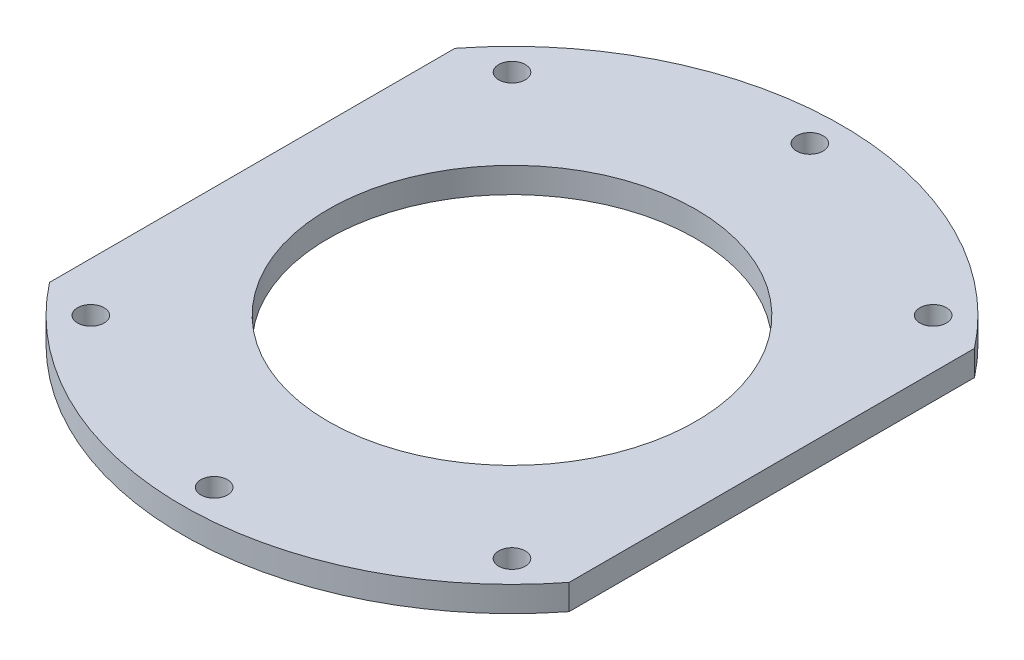
ISO-10303-21;
HEADER;
FILE_DESCRIPTION(('STEP AP214'),'2;1');
FILE_NAME('part.step','',(''),(''),'','','');
FILE_SCHEMA(('AUTOMOTIVE_DESIGN { 1 0 10303 214 1 1 1 1 }'));
ENDSEC;
DATA;
#1=APPLICATION_CONTEXT('core data for automotive mechanical design processes');
#2=APPLICATION_PROTOCOL_DEFINITION('international standard','automotive_design',2000,#1);
#3=PRODUCT_CONTEXT('',#1,'mechanical');
#4=PRODUCT('Part','Part','',(#3));
#5=PRODUCT_RELATED_PRODUCT_CATEGORY('part','',(#4));
#6=PRODUCT_DEFINITION_FORMATION('','',#4);
#7=PRODUCT_DEFINITION_CONTEXT('part definition',#1,'design');
#8=PRODUCT_DEFINITION('design','',#6,#7);
#9=PRODUCT_DEFINITION_SHAPE('','',#8);
#10=(LENGTH_UNIT() NAMED_UNIT(*) SI_UNIT(.MILLI.,.METRE.));
#11=(NAMED_UNIT(*) PLANE_ANGLE_UNIT() SI_UNIT($,.RADIAN.));
#12=(NAMED_UNIT(*) SI_UNIT($,.STERADIAN.) SOLID_ANGLE_UNIT());
#13=UNCERTAINTY_MEASURE_WITH_UNIT(LENGTH_MEASURE(1.E-05),#10,'distance_accuracy_value','');
#14=(GEOMETRIC_REPRESENTATION_CONTEXT(3) GLOBAL_UNCERTAINTY_ASSIGNED_CONTEXT((#13)) GLOBAL_UNIT_ASSIGNED_CONTEXT((#10,
#11,#12)) REPRESENTATION_CONTEXT('',''));
#15=CARTESIAN_POINT('',(0.,0.,0.));
#16=DIRECTION('',(0.,0.,1.));
#17=DIRECTION('',(1.,0.,0.));
#18=AXIS2_PLACEMENT_3D('',#15,#16,#17);
#19=CARTESIAN_POINT('',(0.,4.,0.));
#20=DIRECTION('',(0.,1.,0.));
#21=DIRECTION('',(0.,0.,1.));
#22=AXIS2_PLACEMENT_3D('',#19,#20,#21);
#23=PLANE('',#22);
#24=CARTESIAN_POINT('',(0.,4.,-47.));
#25=DIRECTION('',(0.,1.,0.));
#26=DIRECTION('',(0.,0.,1.));
#27=AXIS2_PLACEMENT_3D('',#24,#25,#26);
#28=CIRCLE('',#27,2.1);
#29=CARTESIAN_POINT('',(0.,4.,-44.9));
#30=VERTEX_POINT('',#29);
#31=EDGE_CURVE('E265',#30,#30,#28,.T.);
#32=ORIENTED_EDGE('',*,*,#31,.F.);
#33=EDGE_LOOP('',(#32));
#34=FACE_BOUND('',#33,.T.);
#35=CARTESIAN_POINT('',(0.,4.,47.));
#36=DIRECTION('',(0.,1.,0.));
#37=DIRECTION('',(0.,0.,1.));
#38=AXIS2_PLACEMENT_3D('',#35,#36,#37);
#39=CIRCLE('',#38,2.1);
#40=CARTESIAN_POINT('',(0.,4.,49.1));
#41=VERTEX_POINT('',#40);
#42=EDGE_CURVE('E283',#41,#41,#39,.T.);
#43=ORIENTED_EDGE('',*,*,#42,.F.);
#44=EDGE_LOOP('',(#43));
#45=FACE_BOUND('',#44,.T.);
#46=CARTESIAN_POINT('',(0.,4.,0.));
#47=DIRECTION('',(0.,1.,0.));
#48=DIRECTION('',(0.,0.,1.));
#49=AXIS2_PLACEMENT_3D('',#46,#47,#48);
#50=CIRCLE('',#49,29.);
#51=CARTESIAN_POINT('',(0.,4.,29.));
#52=VERTEX_POINT('',#51);
#53=EDGE_CURVE('E122',#52,#52,#50,.T.);
#54=ORIENTED_EDGE('',*,*,#53,.F.);
#55=EDGE_LOOP('',(#54));
#56=FACE_BOUND('',#55,.T.);
#57=CARTESIAN_POINT('',(33.2340187157677,4.,33.2340187157677));
#58=DIRECTION('',(0.,1.,0.));
#59=DIRECTION('',(0.,0.,1.));
#60=AXIS2_PLACEMENT_3D('',#57,#58,#59);
#61=CIRCLE('',#60,2.1);
#62=CARTESIAN_POINT('',(33.2340187157677,4.,35.3340187157677));
#63=VERTEX_POINT('',#62);
#64=EDGE_CURVE('E289',#63,#63,#61,.T.);
#65=ORIENTED_EDGE('',*,*,#64,.F.);
#66=EDGE_LOOP('',(#65));
#67=FACE_BOUND('',#66,.T.);
#68=CARTESIAN_POINT('',(-33.2340187157677,4.,33.2340187157677));
#69=DIRECTION('',(0.,1.,0.));
#70=DIRECTION('',(0.,0.,1.));
#71=AXIS2_PLACEMENT_3D('',#68,#69,#70);
#72=CIRCLE('',#71,2.1);
#73=CARTESIAN_POINT('',(-33.2340187157677,4.,35.3340187157677));
#74=VERTEX_POINT('',#73);
#75=EDGE_CURVE('E277',#74,#74,#72,.T.);
#76=ORIENTED_EDGE('',*,*,#75,.F.);
#77=EDGE_LOOP('',(#76));
#78=FACE_BOUND('',#77,.T.);
#79=CARTESIAN_POINT('',(-33.2340187157677,4.,-33.2340187157677));
#80=DIRECTION('',(0.,1.,0.));
#81=DIRECTION('',(0.,0.,1.));
#82=AXIS2_PLACEMENT_3D('',#79,#80,#81);
#83=CIRCLE('',#82,2.1);
#84=CARTESIAN_POINT('',(-33.2340187157677,4.,-31.1340187157677));
#85=VERTEX_POINT('',#84);
#86=EDGE_CURVE('E271',#85,#85,#83,.T.);
#87=ORIENTED_EDGE('',*,*,#86,.F.);
#88=EDGE_LOOP('',(#87));
#89=FACE_BOUND('',#88,.T.);
#90=CARTESIAN_POINT('',(33.2340187157677,4.,-33.2340187157677));
#91=DIRECTION('',(0.,1.,0.));
#92=DIRECTION('',(0.,0.,1.));
#93=AXIS2_PLACEMENT_3D('',#90,#91,#92);
#94=CIRCLE('',#93,2.1);
#95=CARTESIAN_POINT('',(33.2340187157677,4.,-31.1340187157677));
#96=VERTEX_POINT('',#95);
#97=EDGE_CURVE('E256',#96,#96,#94,.T.);
#98=ORIENTED_EDGE('',*,*,#97,.F.);
#99=EDGE_LOOP('',(#98));
#100=FACE_BOUND('',#99,.T.);
#101=CARTESIAN_POINT('',(0.,4.,0.));
#102=DIRECTION('',(0.,1.,0.));
#103=DIRECTION('',(0.,0.,1.));
#104=AXIS2_PLACEMENT_3D('',#101,#102,#103);
#105=CIRCLE('',#104,52.);
#106=CARTESIAN_POINT('',(-41.,4.,31.984371183439));
#107=VERTEX_POINT('',#106);
#108=CARTESIAN_POINT('',(41.,4.,31.984371183439));
#109=VERTEX_POINT('',#108);
#110=EDGE_CURVE('E108',#107,#109,#105,.T.);
#111=ORIENTED_EDGE('',*,*,#110,.T.);
#112=DIRECTION('',(0.,0.,-1.));
#113=VECTOR('',#112,1.);
#114=CARTESIAN_POINT('',(41.,4.,55.0176136765046));
#115=LINE('',#114,#113);
#116=CARTESIAN_POINT('',(41.,4.,-31.984371183439));
#117=VERTEX_POINT('',#116);
#118=EDGE_CURVE('E96',#109,#117,#115,.T.);
#119=ORIENTED_EDGE('',*,*,#118,.T.);
#120=CARTESIAN_POINT('',(-41.,4.,-31.984371183439));
#121=VERTEX_POINT('',#120);
#122=EDGE_CURVE('E112',#117,#121,#105,.T.);
#123=ORIENTED_EDGE('',*,*,#122,.T.);
#124=DIRECTION('',(0.,0.,1.));
#125=VECTOR('',#124,1.);
#126=CARTESIAN_POINT('',(-41.,4.,55.0176136765046));
#127=LINE('',#126,#125);
#128=EDGE_CURVE('E103',#121,#107,#127,.T.);
#129=ORIENTED_EDGE('',*,*,#128,.T.);
#130=EDGE_LOOP('',(#111,#119,#123,#129));
#131=FACE_BOUND('',#130,.T.);
#132=ADVANCED_FACE('F58',(#34,#45,#56,#67,#78,#89,#100,#131),#23,.T.);
#133=CARTESIAN_POINT('',(0.,0.,0.));
#134=DIRECTION('',(0.,1.,0.));
#135=DIRECTION('',(0.,0.,1.));
#136=AXIS2_PLACEMENT_3D('',#133,#134,#135);
#137=PLANE('',#136);
#138=CARTESIAN_POINT('',(0.,0.,0.));
#139=DIRECTION('',(0.,1.,0.));
#140=DIRECTION('',(0.,0.,1.));
#141=AXIS2_PLACEMENT_3D('',#138,#139,#140);
#142=CIRCLE('',#141,29.);
#143=CARTESIAN_POINT('',(0.,0.,29.));
#144=VERTEX_POINT('',#143);
#145=EDGE_CURVE('E119',#144,#144,#142,.T.);
#146=ORIENTED_EDGE('',*,*,#145,.T.);
#147=EDGE_LOOP('',(#146));
#148=FACE_BOUND('',#147,.T.);
#149=CARTESIAN_POINT('',(33.2340187157677,0.,33.2340187157677));
#150=DIRECTION('',(0.,1.,0.));
#151=DIRECTION('',(0.,0.,1.));
#152=AXIS2_PLACEMENT_3D('',#149,#150,#151);
#153=CIRCLE('',#152,2.1);
#154=CARTESIAN_POINT('',(33.2340187157677,0.,35.3340187157677));
#155=VERTEX_POINT('',#154);
#156=EDGE_CURVE('E286',#155,#155,#153,.T.);
#157=ORIENTED_EDGE('',*,*,#156,.T.);
#158=EDGE_LOOP('',(#157));
#159=FACE_BOUND('',#158,.T.);
#160=CARTESIAN_POINT('',(0.,0.,47.));
#161=DIRECTION('',(0.,1.,0.));
#162=DIRECTION('',(0.,0.,1.));
#163=AXIS2_PLACEMENT_3D('',#160,#161,#162);
#164=CIRCLE('',#163,2.1);
#165=CARTESIAN_POINT('',(0.,0.,49.1));
#166=VERTEX_POINT('',#165);
#167=EDGE_CURVE('E280',#166,#166,#164,.T.);
#168=ORIENTED_EDGE('',*,*,#167,.T.);
#169=EDGE_LOOP('',(#168));
#170=FACE_BOUND('',#169,.T.);
#171=CARTESIAN_POINT('',(-33.2340187157677,0.,33.2340187157677));
#172=DIRECTION('',(0.,1.,0.));
#173=DIRECTION('',(0.,0.,1.));
#174=AXIS2_PLACEMENT_3D('',#171,#172,#173);
#175=CIRCLE('',#174,2.1);
#176=CARTESIAN_POINT('',(-33.2340187157677,0.,35.3340187157677));
#177=VERTEX_POINT('',#176);
#178=EDGE_CURVE('E274',#177,#177,#175,.T.);
#179=ORIENTED_EDGE('',*,*,#178,.T.);
#180=EDGE_LOOP('',(#179));
#181=FACE_BOUND('',#180,.T.);
#182=CARTESIAN_POINT('',(-33.2340187157677,0.,-33.2340187157677));
#183=DIRECTION('',(0.,1.,0.));
#184=DIRECTION('',(0.,0.,1.));
#185=AXIS2_PLACEMENT_3D('',#182,#183,#184);
#186=CIRCLE('',#185,2.1);
#187=CARTESIAN_POINT('',(-33.2340187157677,0.,-31.1340187157677));
#188=VERTEX_POINT('',#187);
#189=EDGE_CURVE('E268',#188,#188,#186,.T.);
#190=ORIENTED_EDGE('',*,*,#189,.T.);
#191=EDGE_LOOP('',(#190));
#192=FACE_BOUND('',#191,.T.);
#193=CARTESIAN_POINT('',(0.,0.,-47.));
#194=DIRECTION('',(0.,1.,0.));
#195=DIRECTION('',(0.,0.,1.));
#196=AXIS2_PLACEMENT_3D('',#193,#194,#195);
#197=CIRCLE('',#196,2.1);
#198=CARTESIAN_POINT('',(0.,0.,-44.9));
#199=VERTEX_POINT('',#198);
#200=EDGE_CURVE('E261',#199,#199,#197,.T.);
#201=ORIENTED_EDGE('',*,*,#200,.T.);
#202=EDGE_LOOP('',(#201));
#203=FACE_BOUND('',#202,.T.);
#204=CARTESIAN_POINT('',(33.2340187157677,0.,-33.2340187157677));
#205=DIRECTION('',(0.,1.,0.));
#206=DIRECTION('',(0.,0.,1.));
#207=AXIS2_PLACEMENT_3D('',#204,#205,#206);
#208=CIRCLE('',#207,2.1);
#209=CARTESIAN_POINT('',(33.2340187157677,0.,-31.1340187157677));
#210=VERTEX_POINT('',#209);
#211=EDGE_CURVE('E131',#210,#210,#208,.T.);
#212=ORIENTED_EDGE('',*,*,#211,.T.);
#213=EDGE_LOOP('',(#212));
#214=FACE_BOUND('',#213,.T.);
#215=DIRECTION('',(0.,0.,-1.));
#216=VECTOR('',#215,1.);
#217=CARTESIAN_POINT('',(41.,0.,55.0176136765046));
#218=LINE('',#217,#216);
#219=CARTESIAN_POINT('',(41.,0.,31.984371183439));
#220=VERTEX_POINT('',#219);
#221=CARTESIAN_POINT('',(41.,0.,-31.984371183439));
#222=VERTEX_POINT('',#221);
#223=EDGE_CURVE('E80',#220,#222,#218,.T.);
#224=ORIENTED_EDGE('',*,*,#223,.F.);
#225=CARTESIAN_POINT('',(0.,0.,0.));
#226=DIRECTION('',(0.,1.,0.));
#227=DIRECTION('',(0.,0.,1.));
#228=AXIS2_PLACEMENT_3D('',#225,#226,#227);
#229=CIRCLE('',#228,52.);
#230=CARTESIAN_POINT('',(-41.,0.,31.984371183439));
#231=VERTEX_POINT('',#230);
#232=EDGE_CURVE('E110',#231,#220,#229,.T.);
#233=ORIENTED_EDGE('',*,*,#232,.F.);
#234=DIRECTION('',(0.,0.,1.));
#235=VECTOR('',#234,1.);
#236=CARTESIAN_POINT('',(-41.,0.,55.0176136765046));
#237=LINE('',#236,#235);
#238=CARTESIAN_POINT('',(-41.,0.,-31.984371183439));
#239=VERTEX_POINT('',#238);
#240=EDGE_CURVE('E73',#239,#231,#237,.T.);
#241=ORIENTED_EDGE('',*,*,#240,.F.);
#242=EDGE_CURVE('E113',#222,#239,#229,.T.);
#243=ORIENTED_EDGE('',*,*,#242,.F.);
#244=EDGE_LOOP('',(#224,#233,#241,#243));
#245=FACE_BOUND('',#244,.T.);
#246=ADVANCED_FACE('F130',(#148,#159,#170,#181,#192,#203,#214,#245),#137,.F.);
#247=CARTESIAN_POINT('',(0.,4.,0.));
#248=DIRECTION('',(0.,-1.,0.));
#249=DIRECTION('',(0.,0.,-1.));
#250=AXIS2_PLACEMENT_3D('',#247,#248,#249);
#251=CYLINDRICAL_SURFACE('',#250,52.);
#252=DIRECTION('',(0.,-1.,0.));
#253=VECTOR('',#252,1.);
#254=CARTESIAN_POINT('',(41.,4.,31.984371183439));
#255=LINE('',#254,#253);
#256=EDGE_CURVE('E12',#109,#220,#255,.T.);
#257=ORIENTED_EDGE('',*,*,#256,.F.);
#258=ORIENTED_EDGE('',*,*,#110,.F.);
#259=DIRECTION('',(0.,-1.,0.));
#260=VECTOR('',#259,1.);
#261=CARTESIAN_POINT('',(-41.,4.,31.984371183439));
#262=LINE('',#261,#260);
#263=EDGE_CURVE('E115',#231,#107,#262,.F.);
#264=ORIENTED_EDGE('',*,*,#263,.F.);
#265=ORIENTED_EDGE('',*,*,#232,.T.);
#266=EDGE_LOOP('',(#257,#258,#264,#265));
#267=FACE_BOUND('',#266,.T.);
#268=ADVANCED_FACE('F60',(#267),#251,.T.);
#269=DIRECTION('',(0.,-1.,0.));
#270=VECTOR('',#269,1.);
#271=CARTESIAN_POINT('',(41.,4.,-31.984371183439));
#272=LINE('',#271,#270);
#273=EDGE_CURVE('E66',#222,#117,#272,.F.);
#274=ORIENTED_EDGE('',*,*,#273,.F.);
#275=ORIENTED_EDGE('',*,*,#242,.T.);
#276=DIRECTION('',(0.,-1.,0.));
#277=VECTOR('',#276,1.);
#278=CARTESIAN_POINT('',(-41.,4.,-31.984371183439));
#279=LINE('',#278,#277);
#280=EDGE_CURVE('E124',#121,#239,#279,.T.);
#281=ORIENTED_EDGE('',*,*,#280,.F.);
#282=ORIENTED_EDGE('',*,*,#122,.F.);
#283=EDGE_LOOP('',(#274,#275,#281,#282));
#284=FACE_BOUND('',#283,.T.);
#285=ADVANCED_FACE('F133',(#284),#251,.T.);
#286=CARTESIAN_POINT('',(0.,4.,0.));
#287=DIRECTION('',(0.,-1.,0.));
#288=DIRECTION('',(0.,0.,-1.));
#289=AXIS2_PLACEMENT_3D('',#286,#287,#288);
#290=CYLINDRICAL_SURFACE('',#289,29.);
#291=ORIENTED_EDGE('',*,*,#53,.T.);
#292=EDGE_LOOP('',(#291));
#293=FACE_BOUND('',#292,.T.);
#294=ORIENTED_EDGE('',*,*,#145,.F.);
#295=EDGE_LOOP('',(#294));
#296=FACE_BOUND('',#295,.T.);
#297=ADVANCED_FACE('F135',(#293,#296),#290,.F.);
#298=CARTESIAN_POINT('',(33.2340187157677,4.,33.2340187157677));
#299=DIRECTION('',(0.,-1.,0.));
#300=DIRECTION('',(0.,0.,-1.));
#301=AXIS2_PLACEMENT_3D('',#298,#299,#300);
#302=CYLINDRICAL_SURFACE('',#301,2.1);
#303=ORIENTED_EDGE('',*,*,#64,.T.);
#304=EDGE_LOOP('',(#303));
#305=FACE_BOUND('',#304,.T.);
#306=ORIENTED_EDGE('',*,*,#156,.F.);
#307=EDGE_LOOP('',(#306));
#308=FACE_BOUND('',#307,.T.);
#309=ADVANCED_FACE('F140',(#305,#308),#302,.F.);
#310=CARTESIAN_POINT('',(0.,4.,47.));
#311=DIRECTION('',(0.,-1.,0.));
#312=DIRECTION('',(0.,0.,-1.));
#313=AXIS2_PLACEMENT_3D('',#310,#311,#312);
#314=CYLINDRICAL_SURFACE('',#313,2.1);
#315=ORIENTED_EDGE('',*,*,#42,.T.);
#316=EDGE_LOOP('',(#315));
#317=FACE_BOUND('',#316,.T.);
#318=ORIENTED_EDGE('',*,*,#167,.F.);
#319=EDGE_LOOP('',(#318));
#320=FACE_BOUND('',#319,.T.);
#321=ADVANCED_FACE('F155',(#317,#320),#314,.F.);
#322=CARTESIAN_POINT('',(-33.2340187157677,4.,33.2340187157677));
#323=DIRECTION('',(0.,-1.,0.));
#324=DIRECTION('',(0.,0.,-1.));
#325=AXIS2_PLACEMENT_3D('',#322,#323,#324);
#326=CYLINDRICAL_SURFACE('',#325,2.1);
#327=ORIENTED_EDGE('',*,*,#75,.T.);
#328=EDGE_LOOP('',(#327));
#329=FACE_BOUND('',#328,.T.);
#330=ORIENTED_EDGE('',*,*,#178,.F.);
#331=EDGE_LOOP('',(#330));
#332=FACE_BOUND('',#331,.T.);
#333=ADVANCED_FACE('F159',(#329,#332),#326,.F.);
#334=CARTESIAN_POINT('',(-33.2340187157677,4.,-33.2340187157677));
#335=DIRECTION('',(0.,-1.,0.));
#336=DIRECTION('',(0.,0.,-1.));
#337=AXIS2_PLACEMENT_3D('',#334,#335,#336);
#338=CYLINDRICAL_SURFACE('',#337,2.1);
#339=ORIENTED_EDGE('',*,*,#86,.T.);
#340=EDGE_LOOP('',(#339));
#341=FACE_BOUND('',#340,.T.);
#342=ORIENTED_EDGE('',*,*,#189,.F.);
#343=EDGE_LOOP('',(#342));
#344=FACE_BOUND('',#343,.T.);
#345=ADVANCED_FACE('F163',(#341,#344),#338,.F.);
#346=CARTESIAN_POINT('',(0.,4.,-47.));
#347=DIRECTION('',(0.,-1.,0.));
#348=DIRECTION('',(0.,0.,-1.));
#349=AXIS2_PLACEMENT_3D('',#346,#347,#348);
#350=CYLINDRICAL_SURFACE('',#349,2.1);
#351=ORIENTED_EDGE('',*,*,#31,.T.);
#352=EDGE_LOOP('',(#351));
#353=FACE_BOUND('',#352,.T.);
#354=ORIENTED_EDGE('',*,*,#200,.F.);
#355=EDGE_LOOP('',(#354));
#356=FACE_BOUND('',#355,.T.);
#357=ADVANCED_FACE('F167',(#353,#356),#350,.F.);
#358=CARTESIAN_POINT('',(33.2340187157677,4.,-33.2340187157677));
#359=DIRECTION('',(0.,-1.,0.));
#360=DIRECTION('',(0.,0.,-1.));
#361=AXIS2_PLACEMENT_3D('',#358,#359,#360);
#362=CYLINDRICAL_SURFACE('',#361,2.1);
#363=ORIENTED_EDGE('',*,*,#97,.T.);
#364=EDGE_LOOP('',(#363));
#365=FACE_BOUND('',#364,.T.);
#366=ORIENTED_EDGE('',*,*,#211,.F.);
#367=EDGE_LOOP('',(#366));
#368=FACE_BOUND('',#367,.T.);
#369=ADVANCED_FACE('F171',(#365,#368),#362,.F.);
#370=CARTESIAN_POINT('',(-41.,0.,55.0176136765046));
#371=DIRECTION('',(-1.,0.,0.));
#372=DIRECTION('',(0.,0.,1.));
#373=AXIS2_PLACEMENT_3D('',#370,#371,#372);
#374=PLANE('',#373);
#375=ORIENTED_EDGE('',*,*,#280,.T.);
#376=ORIENTED_EDGE('',*,*,#240,.T.);
#377=ORIENTED_EDGE('',*,*,#263,.T.);
#378=ORIENTED_EDGE('',*,*,#128,.F.);
#379=EDGE_LOOP('',(#375,#376,#377,#378));
#380=FACE_BOUND('',#379,.T.);
#381=ADVANCED_FACE('F126',(#380),#374,.T.);
#382=CARTESIAN_POINT('',(41.,0.,55.0176136765046));
#383=DIRECTION('',(1.,0.,0.));
#384=DIRECTION('',(0.,0.,-1.));
#385=AXIS2_PLACEMENT_3D('',#382,#383,#384);
#386=PLANE('',#385);
#387=ORIENTED_EDGE('',*,*,#256,.T.);
#388=ORIENTED_EDGE('',*,*,#223,.T.);
#389=ORIENTED_EDGE('',*,*,#273,.T.);
#390=ORIENTED_EDGE('',*,*,#118,.F.);
#391=EDGE_LOOP('',(#387,#388,#389,#390));
#392=FACE_BOUND('',#391,.T.);
#393=ADVANCED_FACE('F98',(#392),#386,.T.);
#394=CLOSED_SHELL('',(#132,#246,#268,#285,#297,#309,#321,#333,#345,#357,#369,#381,#393));
#395=MANIFOLD_SOLID_BREP('B2',#394);
#396=ADVANCED_BREP_SHAPE_REPRESENTATION('',(#18,#395),#14);
#397=SHAPE_DEFINITION_REPRESENTATION(#9,#396);
ENDSEC;
END-ISO-10303-21;
